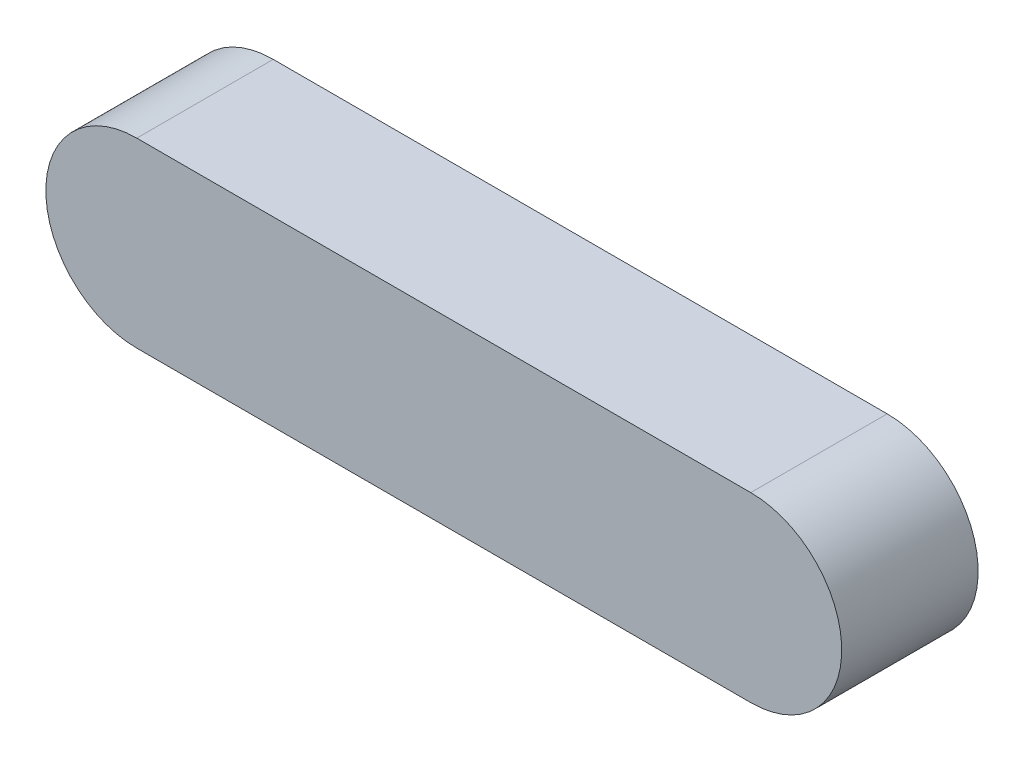
ISO-10303-21;
HEADER;
FILE_DESCRIPTION(('STEP AP214'),'2;1');
FILE_NAME('part.step','',(''),(''),'','','');
FILE_SCHEMA(('AUTOMOTIVE_DESIGN { 1 0 10303 214 1 1 1 1 }'));
ENDSEC;
DATA;
#1=APPLICATION_CONTEXT('core data for automotive mechanical design processes');
#2=APPLICATION_PROTOCOL_DEFINITION('international standard','automotive_design',2000,#1);
#3=PRODUCT_CONTEXT('',#1,'mechanical');
#4=PRODUCT('Part','Part','',(#3));
#5=PRODUCT_RELATED_PRODUCT_CATEGORY('part','',(#4));
#6=PRODUCT_DEFINITION_FORMATION('','',#4);
#7=PRODUCT_DEFINITION_CONTEXT('part definition',#1,'design');
#8=PRODUCT_DEFINITION('design','',#6,#7);
#9=PRODUCT_DEFINITION_SHAPE('','',#8);
#10=(LENGTH_UNIT() NAMED_UNIT(*) SI_UNIT(.MILLI.,.METRE.));
#11=(NAMED_UNIT(*) PLANE_ANGLE_UNIT() SI_UNIT($,.RADIAN.));
#12=(NAMED_UNIT(*) SI_UNIT($,.STERADIAN.) SOLID_ANGLE_UNIT());
#13=UNCERTAINTY_MEASURE_WITH_UNIT(LENGTH_MEASURE(1.E-05),#10,'distance_accuracy_value','');
#14=(GEOMETRIC_REPRESENTATION_CONTEXT(3) GLOBAL_UNCERTAINTY_ASSIGNED_CONTEXT((#13)) GLOBAL_UNIT_ASSIGNED_CONTEXT((#10,
#11,#12)) REPRESENTATION_CONTEXT('',''));
#15=CARTESIAN_POINT('',(0.,0.,0.));
#16=DIRECTION('',(0.,0.,1.));
#17=DIRECTION('',(1.,0.,0.));
#18=AXIS2_PLACEMENT_3D('',#15,#16,#17);
#19=CARTESIAN_POINT('',(-27.,0.,12.));
#20=DIRECTION('',(0.,0.,-1.));
#21=DIRECTION('',(-1.,0.,0.));
#22=AXIS2_PLACEMENT_3D('',#19,#20,#21);
#23=CYLINDRICAL_SURFACE('',#22,7.99999999999998);
#24=CARTESIAN_POINT('',(-27.,0.,0.));
#25=DIRECTION('',(0.,0.,1.));
#26=DIRECTION('',(1.,0.,0.));
#27=AXIS2_PLACEMENT_3D('',#24,#25,#26);
#28=CIRCLE('',#27,7.99999999999998);
#29=CARTESIAN_POINT('',(-27.,7.99999999999998,0.));
#30=VERTEX_POINT('',#29);
#31=CARTESIAN_POINT('',(-27.,-7.99999999999998,0.));
#32=VERTEX_POINT('',#31);
#33=EDGE_CURVE('E100',#30,#32,#28,.T.);
#34=ORIENTED_EDGE('',*,*,#33,.T.);
#35=DIRECTION('',(0.,0.,-1.));
#36=VECTOR('',#35,1.);
#37=CARTESIAN_POINT('',(-27.,-7.99999999999998,12.));
#38=LINE('',#37,#36);
#39=CARTESIAN_POINT('',(-27.,-7.99999999999998,12.));
#40=VERTEX_POINT('',#39);
#41=EDGE_CURVE('E11',#40,#32,#38,.T.);
#42=ORIENTED_EDGE('',*,*,#41,.F.);
#43=CARTESIAN_POINT('',(-27.,0.,12.));
#44=DIRECTION('',(0.,0.,1.));
#45=DIRECTION('',(1.,0.,0.));
#46=AXIS2_PLACEMENT_3D('',#43,#44,#45);
#47=CIRCLE('',#46,7.99999999999998);
#48=CARTESIAN_POINT('',(-27.,7.99999999999998,12.));
#49=VERTEX_POINT('',#48);
#50=EDGE_CURVE('E88',#49,#40,#47,.T.);
#51=ORIENTED_EDGE('',*,*,#50,.F.);
#52=DIRECTION('',(0.,0.,-1.));
#53=VECTOR('',#52,1.);
#54=CARTESIAN_POINT('',(-27.,7.99999999999998,12.));
#55=LINE('',#54,#53);
#56=EDGE_CURVE('E96',#49,#30,#55,.T.);
#57=ORIENTED_EDGE('',*,*,#56,.T.);
#58=EDGE_LOOP('',(#34,#42,#51,#57));
#59=FACE_BOUND('',#58,.T.);
#60=ADVANCED_FACE('F37',(#59),#23,.T.);
#61=CARTESIAN_POINT('',(-27.,-7.99999999999998,12.));
#62=DIRECTION('',(0.,1.,0.));
#63=DIRECTION('',(-1.,0.,0.));
#64=AXIS2_PLACEMENT_3D('',#61,#62,#63);
#65=PLANE('',#64);
#66=DIRECTION('',(1.,0.,0.));
#67=VECTOR('',#66,1.);
#68=CARTESIAN_POINT('',(-27.,-7.99999999999998,0.));
#69=LINE('',#68,#67);
#70=CARTESIAN_POINT('',(27.,-7.99999999999998,0.));
#71=VERTEX_POINT('',#70);
#72=EDGE_CURVE('E92',#32,#71,#69,.T.);
#73=ORIENTED_EDGE('',*,*,#72,.T.);
#74=DIRECTION('',(0.,0.,-1.));
#75=VECTOR('',#74,1.);
#76=CARTESIAN_POINT('',(27.,-7.99999999999998,12.));
#77=LINE('',#76,#75);
#78=CARTESIAN_POINT('',(27.,-7.99999999999998,12.));
#79=VERTEX_POINT('',#78);
#80=EDGE_CURVE('E45',#79,#71,#77,.T.);
#81=ORIENTED_EDGE('',*,*,#80,.F.);
#82=DIRECTION('',(1.,0.,0.));
#83=VECTOR('',#82,1.);
#84=CARTESIAN_POINT('',(-27.,-7.99999999999998,12.));
#85=LINE('',#84,#83);
#86=EDGE_CURVE('E83',#40,#79,#85,.T.);
#87=ORIENTED_EDGE('',*,*,#86,.F.);
#88=ORIENTED_EDGE('',*,*,#41,.T.);
#89=EDGE_LOOP('',(#73,#81,#87,#88));
#90=FACE_BOUND('',#89,.T.);
#91=ADVANCED_FACE('F91',(#90),#65,.F.);
#92=CARTESIAN_POINT('',(27.,0.,12.));
#93=DIRECTION('',(0.,0.,-1.));
#94=DIRECTION('',(-1.,0.,0.));
#95=AXIS2_PLACEMENT_3D('',#92,#93,#94);
#96=CYLINDRICAL_SURFACE('',#95,7.99999999999998);
#97=CARTESIAN_POINT('',(27.,0.,0.));
#98=DIRECTION('',(0.,0.,1.));
#99=DIRECTION('',(1.,0.,0.));
#100=AXIS2_PLACEMENT_3D('',#97,#98,#99);
#101=CIRCLE('',#100,7.99999999999998);
#102=CARTESIAN_POINT('',(27.,7.99999999999999,0.));
#103=VERTEX_POINT('',#102);
#104=EDGE_CURVE('E70',#71,#103,#101,.T.);
#105=ORIENTED_EDGE('',*,*,#104,.T.);
#106=DIRECTION('',(0.,0.,-1.));
#107=VECTOR('',#106,1.);
#108=CARTESIAN_POINT('',(27.,7.99999999999999,12.));
#109=LINE('',#108,#107);
#110=CARTESIAN_POINT('',(27.,7.99999999999999,12.));
#111=VERTEX_POINT('',#110);
#112=EDGE_CURVE('E93',#111,#103,#109,.T.);
#113=ORIENTED_EDGE('',*,*,#112,.F.);
#114=CARTESIAN_POINT('',(27.,0.,12.));
#115=DIRECTION('',(0.,0.,1.));
#116=DIRECTION('',(1.,0.,0.));
#117=AXIS2_PLACEMENT_3D('',#114,#115,#116);
#118=CIRCLE('',#117,7.99999999999998);
#119=EDGE_CURVE('E86',#79,#111,#118,.T.);
#120=ORIENTED_EDGE('',*,*,#119,.F.);
#121=ORIENTED_EDGE('',*,*,#80,.T.);
#122=EDGE_LOOP('',(#105,#113,#120,#121));
#123=FACE_BOUND('',#122,.T.);
#124=ADVANCED_FACE('F94',(#123),#96,.T.);
#125=CARTESIAN_POINT('',(-27.,7.99999999999998,12.));
#126=DIRECTION('',(0.,-1.,0.));
#127=DIRECTION('',(1.,0.,0.));
#128=AXIS2_PLACEMENT_3D('',#125,#126,#127);
#129=PLANE('',#128);
#130=DIRECTION('',(-1.,0.,0.));
#131=VECTOR('',#130,1.);
#132=CARTESIAN_POINT('',(-27.,7.99999999999998,0.));
#133=LINE('',#132,#131);
#134=EDGE_CURVE('E76',#103,#30,#133,.T.);
#135=ORIENTED_EDGE('',*,*,#134,.T.);
#136=ORIENTED_EDGE('',*,*,#56,.F.);
#137=DIRECTION('',(-1.,0.,0.));
#138=VECTOR('',#137,1.);
#139=CARTESIAN_POINT('',(-27.,7.99999999999998,12.));
#140=LINE('',#139,#138);
#141=EDGE_CURVE('E53',#111,#49,#140,.T.);
#142=ORIENTED_EDGE('',*,*,#141,.F.);
#143=ORIENTED_EDGE('',*,*,#112,.T.);
#144=EDGE_LOOP('',(#135,#136,#142,#143));
#145=FACE_BOUND('',#144,.T.);
#146=ADVANCED_FACE('F107',(#145),#129,.F.);
#147=CARTESIAN_POINT('',(-27.,0.,12.));
#148=DIRECTION('',(0.,0.,1.));
#149=DIRECTION('',(1.,0.,0.));
#150=AXIS2_PLACEMENT_3D('',#147,#148,#149);
#151=PLANE('',#150);
#152=ORIENTED_EDGE('',*,*,#50,.T.);
#153=ORIENTED_EDGE('',*,*,#86,.T.);
#154=ORIENTED_EDGE('',*,*,#119,.T.);
#155=ORIENTED_EDGE('',*,*,#141,.T.);
#156=EDGE_LOOP('',(#152,#153,#154,#155));
#157=FACE_BOUND('',#156,.T.);
#158=ADVANCED_FACE('F84',(#157),#151,.T.);
#159=CARTESIAN_POINT('',(-27.,0.,0.));
#160=DIRECTION('',(0.,0.,1.));
#161=DIRECTION('',(1.,0.,0.));
#162=AXIS2_PLACEMENT_3D('',#159,#160,#161);
#163=PLANE('',#162);
#164=ORIENTED_EDGE('',*,*,#33,.F.);
#165=ORIENTED_EDGE('',*,*,#134,.F.);
#166=ORIENTED_EDGE('',*,*,#104,.F.);
#167=ORIENTED_EDGE('',*,*,#72,.F.);
#168=EDGE_LOOP('',(#164,#165,#166,#167));
#169=FACE_BOUND('',#168,.T.);
#170=ADVANCED_FACE('F110',(#169),#163,.F.);
#171=CLOSED_SHELL('',(#60,#91,#124,#146,#158,#170));
#172=MANIFOLD_SOLID_BREP('B2',#171);
#173=ADVANCED_BREP_SHAPE_REPRESENTATION('',(#18,#172),#14);
#174=SHAPE_DEFINITION_REPRESENTATION(#9,#173);
ENDSEC;
END-ISO-10303-21;
